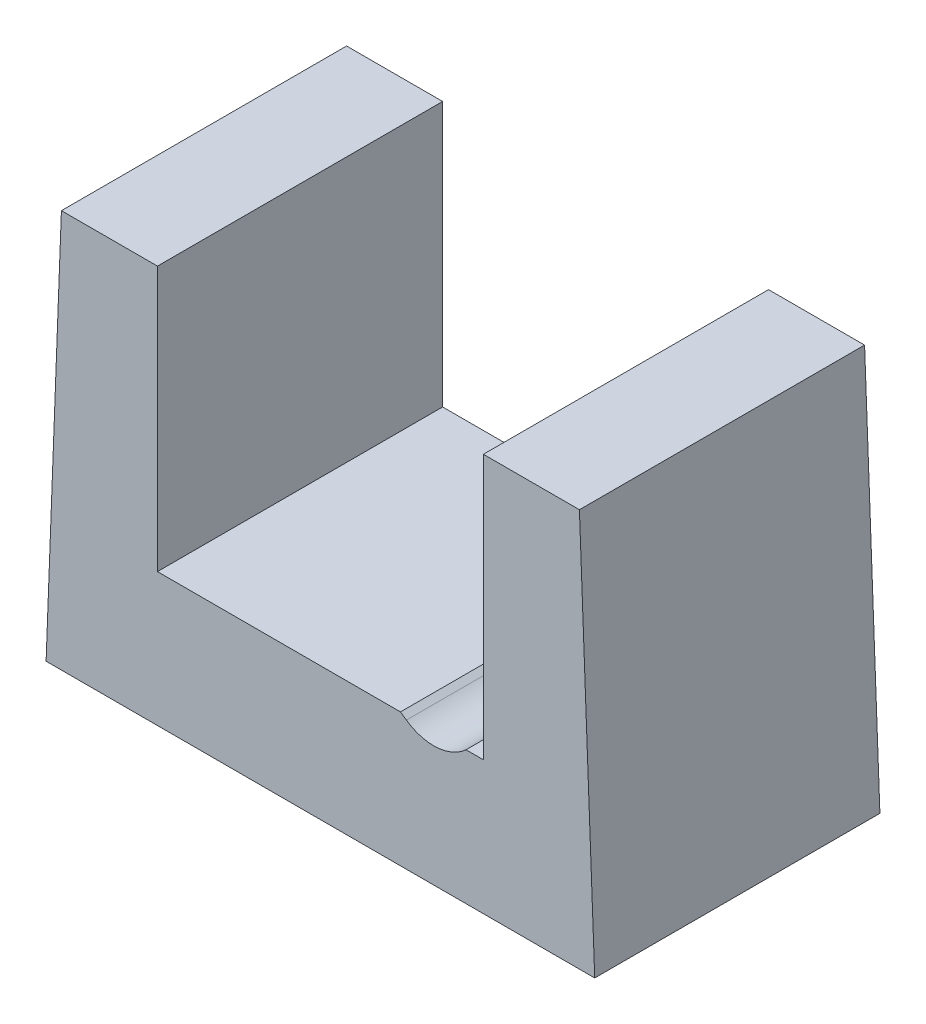
ISO-10303-21;
HEADER;
FILE_DESCRIPTION(('STEP AP214'),'2;1');
FILE_NAME('part.step','',(''),(''),'','','');
FILE_SCHEMA(('AUTOMOTIVE_DESIGN { 1 0 10303 214 1 1 1 1 }'));
ENDSEC;
DATA;
#1=APPLICATION_CONTEXT('core data for automotive mechanical design processes');
#2=APPLICATION_PROTOCOL_DEFINITION('international standard','automotive_design',2000,#1);
#3=PRODUCT_CONTEXT('',#1,'mechanical');
#4=PRODUCT('Part','Part','',(#3));
#5=PRODUCT_RELATED_PRODUCT_CATEGORY('part','',(#4));
#6=PRODUCT_DEFINITION_FORMATION('','',#4);
#7=PRODUCT_DEFINITION_CONTEXT('part definition',#1,'design');
#8=PRODUCT_DEFINITION('design','',#6,#7);
#9=PRODUCT_DEFINITION_SHAPE('','',#8);
#10=(LENGTH_UNIT() NAMED_UNIT(*) SI_UNIT(.MILLI.,.METRE.));
#11=(NAMED_UNIT(*) PLANE_ANGLE_UNIT() SI_UNIT($,.RADIAN.));
#12=(NAMED_UNIT(*) SI_UNIT($,.STERADIAN.) SOLID_ANGLE_UNIT());
#13=UNCERTAINTY_MEASURE_WITH_UNIT(LENGTH_MEASURE(1.E-05),#10,'distance_accuracy_value','');
#14=(GEOMETRIC_REPRESENTATION_CONTEXT(3) GLOBAL_UNCERTAINTY_ASSIGNED_CONTEXT((#13)) GLOBAL_UNIT_ASSIGNED_CONTEXT((#10,
#11,#12)) REPRESENTATION_CONTEXT('',''));
#15=CARTESIAN_POINT('',(0.,0.,0.));
#16=DIRECTION('',(0.,0.,1.));
#17=DIRECTION('',(1.,0.,0.));
#18=AXIS2_PLACEMENT_3D('',#15,#16,#17);
#19=CARTESIAN_POINT('',(0.,147.690874164974,21.));
#20=DIRECTION('',(0.,0.,1.));
#21=DIRECTION('',(1.,0.,0.));
#22=AXIS2_PLACEMENT_3D('',#19,#20,#21);
#23=PLANE('',#22);
#24=DIRECTION('',(0.,-1.,0.));
#25=VECTOR('',#24,1.);
#26=CARTESIAN_POINT('',(-12.,111.380372398628,21.));
#27=LINE('',#26,#25);
#28=CARTESIAN_POINT('',(-12.,120.174052381478,21.));
#29=VERTEX_POINT('',#28);
#30=CARTESIAN_POINT('',(-12.,100.690874164974,21.));
#31=VERTEX_POINT('',#30);
#32=EDGE_CURVE('E169',#29,#31,#27,.T.);
#33=ORIENTED_EDGE('',*,*,#32,.F.);
#34=DIRECTION('',(1.,0.,0.));
#35=VECTOR('',#34,1.);
#36=CARTESIAN_POINT('',(-19.0723488998107,120.174052381478,21.));
#37=LINE('',#36,#35);
#38=CARTESIAN_POINT('',(-19.0723488998107,120.174052381478,21.));
#39=VERTEX_POINT('',#38);
#40=EDGE_CURVE('E184',#39,#29,#37,.T.);
#41=ORIENTED_EDGE('',*,*,#40,.F.);
#42=DIRECTION('',(-0.038457914243594,-0.999260220779369,0.));
#43=VECTOR('',#42,1.);
#44=CARTESIAN_POINT('',(-20.2,90.8740523814777,21.));
#45=LINE('',#44,#43);
#46=CARTESIAN_POINT('',(-20.2,90.8740523814777,21.));
#47=VERTEX_POINT('',#46);
#48=EDGE_CURVE('E219',#39,#47,#45,.T.);
#49=ORIENTED_EDGE('',*,*,#48,.T.);
#50=DIRECTION('',(-1.,0.,0.));
#51=VECTOR('',#50,1.);
#52=CARTESIAN_POINT('',(-20.2,90.8740523814778,21.));
#53=LINE('',#52,#51);
#54=CARTESIAN_POINT('',(20.2,90.8740523814778,21.));
#55=VERTEX_POINT('',#54);
#56=EDGE_CURVE('E191',#55,#47,#53,.T.);
#57=ORIENTED_EDGE('',*,*,#56,.F.);
#58=DIRECTION('',(-0.038457914243594,0.999260220779369,0.));
#59=VECTOR('',#58,1.);
#60=CARTESIAN_POINT('',(20.2,90.8740523814777,21.));
#61=LINE('',#60,#59);
#62=CARTESIAN_POINT('',(19.0723488998107,120.174052381478,21.));
#63=VERTEX_POINT('',#62);
#64=EDGE_CURVE('E216',#55,#63,#61,.T.);
#65=ORIENTED_EDGE('',*,*,#64,.T.);
#66=CARTESIAN_POINT('',(12.,120.174052381478,21.));
#67=VERTEX_POINT('',#66);
#68=EDGE_CURVE('E187',#67,#63,#37,.T.);
#69=ORIENTED_EDGE('',*,*,#68,.F.);
#70=DIRECTION('',(0.,-1.,0.));
#71=VECTOR('',#70,1.);
#72=CARTESIAN_POINT('',(12.,0.,21.));
#73=LINE('',#72,#71);
#74=CARTESIAN_POINT('',(12.,100.690874164974,21.));
#75=VERTEX_POINT('',#74);
#76=EDGE_CURVE('E213',#67,#75,#73,.T.);
#77=ORIENTED_EDGE('',*,*,#76,.T.);
#78=DIRECTION('',(1.,0.,0.));
#79=VECTOR('',#78,1.);
#80=CARTESIAN_POINT('',(12.,100.690874164974,21.));
#81=LINE('',#80,#79);
#82=CARTESIAN_POINT('',(10.722091306153,100.690874164974,21.));
#83=VERTEX_POINT('',#82);
#84=EDGE_CURVE('E178',#83,#75,#81,.T.);
#85=ORIENTED_EDGE('',*,*,#84,.F.);
#86=CARTESIAN_POINT('',(8.33781982131321,103.253148445097,21.));
#87=DIRECTION('',(0.,0.,1.));
#88=DIRECTION('',(1.,0.,0.));
#89=AXIS2_PLACEMENT_3D('',#86,#87,#88);
#90=CIRCLE('',#89,3.5);
#91=CARTESIAN_POINT('',(6.33135958301197,100.385376258867,21.));
#92=VERTEX_POINT('',#91);
#93=EDGE_CURVE('E202',#92,#83,#90,.T.);
#94=ORIENTED_EDGE('',*,*,#93,.F.);
#95=DIRECTION('',(0.819363481780086,-0.573274353800354,0.));
#96=VECTOR('',#95,1.);
#97=CARTESIAN_POINT('',(-5.95909264368933,108.984491565872,21.));
#98=LINE('',#97,#96);
#99=CARTESIAN_POINT('',(5.89472077933055,100.690874164974,21.));
#100=VERTEX_POINT('',#99);
#101=EDGE_CURVE('E200',#100,#92,#98,.T.);
#102=ORIENTED_EDGE('',*,*,#101,.F.);
#103=DIRECTION('',(1.,0.,0.));
#104=VECTOR('',#103,1.);
#105=CARTESIAN_POINT('',(-12.,100.690874164974,21.));
#106=LINE('',#105,#104);
#107=EDGE_CURVE('E158',#31,#100,#106,.T.);
#108=ORIENTED_EDGE('',*,*,#107,.F.);
#109=EDGE_LOOP('',(#33,#41,#49,#57,#65,#69,#77,#85,#94,#102,#108));
#110=FACE_BOUND('',#109,.T.);
#111=ADVANCED_FACE('F69',(#110),#23,.T.);
#112=CARTESIAN_POINT('',(0.,147.690874164974,0.));
#113=DIRECTION('',(0.,0.,1.));
#114=DIRECTION('',(1.,0.,0.));
#115=AXIS2_PLACEMENT_3D('',#112,#113,#114);
#116=PLANE('',#115);
#117=DIRECTION('',(1.,0.,0.));
#118=VECTOR('',#117,1.);
#119=CARTESIAN_POINT('',(-19.0723488998107,120.174052381478,0.));
#120=LINE('',#119,#118);
#121=CARTESIAN_POINT('',(-19.0723488998107,120.174052381478,0.));
#122=VERTEX_POINT('',#121);
#123=CARTESIAN_POINT('',(-12.,120.174052381478,0.));
#124=VERTEX_POINT('',#123);
#125=EDGE_CURVE('E157',#122,#124,#120,.T.);
#126=ORIENTED_EDGE('',*,*,#125,.T.);
#127=DIRECTION('',(0.,1.,0.));
#128=VECTOR('',#127,1.);
#129=CARTESIAN_POINT('',(-12.,111.380372398628,0.));
#130=LINE('',#129,#128);
#131=CARTESIAN_POINT('',(-12.,100.690874164974,0.));
#132=VERTEX_POINT('',#131);
#133=EDGE_CURVE('E84',#132,#124,#130,.T.);
#134=ORIENTED_EDGE('',*,*,#133,.F.);
#135=DIRECTION('',(-1.,0.,0.));
#136=VECTOR('',#135,1.);
#137=CARTESIAN_POINT('',(-12.,100.690874164974,0.));
#138=LINE('',#137,#136);
#139=CARTESIAN_POINT('',(5.89472077933055,100.690874164974,0.));
#140=VERTEX_POINT('',#139);
#141=EDGE_CURVE('E154',#140,#132,#138,.T.);
#142=ORIENTED_EDGE('',*,*,#141,.F.);
#143=DIRECTION('',(-0.819363481780086,0.573274353800354,0.));
#144=VECTOR('',#143,1.);
#145=CARTESIAN_POINT('',(-5.95909264368933,108.984491565872,0.));
#146=LINE('',#145,#144);
#147=CARTESIAN_POINT('',(6.33135958301197,100.385376258867,0.));
#148=VERTEX_POINT('',#147);
#149=EDGE_CURVE('E159',#148,#140,#146,.T.);
#150=ORIENTED_EDGE('',*,*,#149,.F.);
#151=CARTESIAN_POINT('',(8.33781982131321,103.253148445097,0.));
#152=DIRECTION('',(0.,0.,1.));
#153=DIRECTION('',(1.,0.,0.));
#154=AXIS2_PLACEMENT_3D('',#151,#152,#153);
#155=CIRCLE('',#154,3.5);
#156=CARTESIAN_POINT('',(10.722091306153,100.690874164974,0.));
#157=VERTEX_POINT('',#156);
#158=EDGE_CURVE('E196',#157,#148,#155,.F.);
#159=ORIENTED_EDGE('',*,*,#158,.F.);
#160=DIRECTION('',(1.,0.,0.));
#161=VECTOR('',#160,1.);
#162=CARTESIAN_POINT('',(12.,100.690874164974,0.));
#163=LINE('',#162,#161);
#164=CARTESIAN_POINT('',(12.,100.690874164974,0.));
#165=VERTEX_POINT('',#164);
#166=EDGE_CURVE('E173',#157,#165,#163,.T.);
#167=ORIENTED_EDGE('',*,*,#166,.T.);
#168=DIRECTION('',(0.,1.,0.));
#169=VECTOR('',#168,1.);
#170=CARTESIAN_POINT('',(12.,0.,0.));
#171=LINE('',#170,#169);
#172=CARTESIAN_POINT('',(12.,120.174052381478,0.));
#173=VERTEX_POINT('',#172);
#174=EDGE_CURVE('E168',#165,#173,#171,.T.);
#175=ORIENTED_EDGE('',*,*,#174,.T.);
#176=CARTESIAN_POINT('',(19.0723488998107,120.174052381478,0.));
#177=VERTEX_POINT('',#176);
#178=EDGE_CURVE('E91',#173,#177,#120,.T.);
#179=ORIENTED_EDGE('',*,*,#178,.T.);
#180=DIRECTION('',(-0.038457914243594,0.999260220779369,0.));
#181=VECTOR('',#180,1.);
#182=CARTESIAN_POINT('',(20.2,90.8740523814777,0.));
#183=LINE('',#182,#181);
#184=CARTESIAN_POINT('',(20.2,90.8740523814778,0.));
#185=VERTEX_POINT('',#184);
#186=EDGE_CURVE('E215',#185,#177,#183,.T.);
#187=ORIENTED_EDGE('',*,*,#186,.F.);
#188=DIRECTION('',(-1.,0.,0.));
#189=VECTOR('',#188,1.);
#190=CARTESIAN_POINT('',(-20.2,90.8740523814778,0.));
#191=LINE('',#190,#189);
#192=CARTESIAN_POINT('',(-20.2,90.8740523814778,0.));
#193=VERTEX_POINT('',#192);
#194=EDGE_CURVE('E193',#185,#193,#191,.T.);
#195=ORIENTED_EDGE('',*,*,#194,.T.);
#196=DIRECTION('',(-0.038457914243594,-0.999260220779369,0.));
#197=VECTOR('',#196,1.);
#198=CARTESIAN_POINT('',(-20.2,90.8740523814777,0.));
#199=LINE('',#198,#197);
#200=EDGE_CURVE('E220',#122,#193,#199,.T.);
#201=ORIENTED_EDGE('',*,*,#200,.F.);
#202=EDGE_LOOP('',(#126,#134,#142,#150,#159,#167,#175,#179,#187,#195,#201));
#203=FACE_BOUND('',#202,.T.);
#204=ADVANCED_FACE('F152',(#203),#116,.F.);
#205=CARTESIAN_POINT('',(20.2,90.8740523814777,21.));
#206=DIRECTION('',(-0.999260220779368,-0.038457914243594,0.));
#207=DIRECTION('',(0.038457914243594,-0.999260220779369,0.));
#208=AXIS2_PLACEMENT_3D('',#205,#206,#207);
#209=PLANE('',#208);
#210=ORIENTED_EDGE('',*,*,#186,.T.);
#211=DIRECTION('',(0.,0.,1.));
#212=VECTOR('',#211,1.);
#213=CARTESIAN_POINT('',(19.0723488998107,120.174052381478,0.));
#214=LINE('',#213,#212);
#215=EDGE_CURVE('E188',#177,#63,#214,.T.);
#216=ORIENTED_EDGE('',*,*,#215,.T.);
#217=ORIENTED_EDGE('',*,*,#64,.F.);
#218=DIRECTION('',(0.,0.,-1.));
#219=VECTOR('',#218,1.);
#220=CARTESIAN_POINT('',(20.2,90.8740523814777,21.));
#221=LINE('',#220,#219);
#222=EDGE_CURVE('E77',#55,#185,#221,.T.);
#223=ORIENTED_EDGE('',*,*,#222,.T.);
#224=EDGE_LOOP('',(#210,#216,#217,#223));
#225=FACE_BOUND('',#224,.T.);
#226=ADVANCED_FACE('F71',(#225),#209,.F.);
#227=CARTESIAN_POINT('',(-20.2,90.8740523814777,21.));
#228=DIRECTION('',(0.999260220779368,-0.038457914243594,0.));
#229=DIRECTION('',(0.038457914243594,0.999260220779369,0.));
#230=AXIS2_PLACEMENT_3D('',#227,#228,#229);
#231=PLANE('',#230);
#232=ORIENTED_EDGE('',*,*,#48,.F.);
#233=DIRECTION('',(0.,0.,1.));
#234=VECTOR('',#233,1.);
#235=CARTESIAN_POINT('',(-19.0723488998107,120.174052381478,0.));
#236=LINE('',#235,#234);
#237=EDGE_CURVE('E183',#122,#39,#236,.T.);
#238=ORIENTED_EDGE('',*,*,#237,.F.);
#239=ORIENTED_EDGE('',*,*,#200,.T.);
#240=DIRECTION('',(0.,0.,-1.));
#241=VECTOR('',#240,1.);
#242=CARTESIAN_POINT('',(-20.2,90.8740523814777,21.));
#243=LINE('',#242,#241);
#244=EDGE_CURVE('E222',#47,#193,#243,.T.);
#245=ORIENTED_EDGE('',*,*,#244,.F.);
#246=EDGE_LOOP('',(#232,#238,#239,#245));
#247=FACE_BOUND('',#246,.T.);
#248=ADVANCED_FACE('F264',(#247),#231,.F.);
#249=CARTESIAN_POINT('',(12.,0.,-0.001000000000001));
#250=DIRECTION('',(-1.,0.,0.));
#251=DIRECTION('',(0.,0.,1.));
#252=AXIS2_PLACEMENT_3D('',#249,#250,#251);
#253=PLANE('',#252);
#254=DIRECTION('',(0.,0.,1.));
#255=VECTOR('',#254,1.);
#256=CARTESIAN_POINT('',(12.,120.174052381478,-0.001000000000001));
#257=LINE('',#256,#255);
#258=EDGE_CURVE('E12',#173,#67,#257,.T.);
#259=ORIENTED_EDGE('',*,*,#258,.F.);
#260=ORIENTED_EDGE('',*,*,#174,.F.);
#261=DIRECTION('',(0.,0.,1.));
#262=VECTOR('',#261,1.);
#263=CARTESIAN_POINT('',(12.,100.690874164974,0.));
#264=LINE('',#263,#262);
#265=EDGE_CURVE('E239',#165,#75,#264,.T.);
#266=ORIENTED_EDGE('',*,*,#265,.T.);
#267=ORIENTED_EDGE('',*,*,#76,.F.);
#268=EDGE_LOOP('',(#259,#260,#266,#267));
#269=FACE_BOUND('',#268,.T.);
#270=ADVANCED_FACE('F237',(#269),#253,.T.);
#271=CARTESIAN_POINT('',(-12.,100.690874164974,-0.001000000000001));
#272=DIRECTION('',(0.,-1.,0.));
#273=DIRECTION('',(0.,0.,-1.));
#274=AXIS2_PLACEMENT_3D('',#271,#272,#273);
#275=PLANE('',#274);
#276=ORIENTED_EDGE('',*,*,#141,.T.);
#277=DIRECTION('',(0.,0.,1.));
#278=VECTOR('',#277,1.);
#279=CARTESIAN_POINT('',(-12.,100.690874164974,0.));
#280=LINE('',#279,#278);
#281=EDGE_CURVE('E164',#132,#31,#280,.T.);
#282=ORIENTED_EDGE('',*,*,#281,.T.);
#283=ORIENTED_EDGE('',*,*,#107,.T.);
#284=DIRECTION('',(0.,0.,1.));
#285=VECTOR('',#284,1.);
#286=CARTESIAN_POINT('',(5.89472077933055,100.690874164974,0.));
#287=LINE('',#286,#285);
#288=EDGE_CURVE('E166',#140,#100,#287,.T.);
#289=ORIENTED_EDGE('',*,*,#288,.F.);
#290=EDGE_LOOP('',(#276,#282,#283,#289));
#291=FACE_BOUND('',#290,.T.);
#292=ADVANCED_FACE('F163',(#291),#275,.F.);
#293=CARTESIAN_POINT('',(-12.,111.380372398628,-0.001000000000001));
#294=DIRECTION('',(-1.,0.,0.));
#295=DIRECTION('',(0.,0.,1.));
#296=AXIS2_PLACEMENT_3D('',#293,#294,#295);
#297=PLANE('',#296);
#298=ORIENTED_EDGE('',*,*,#32,.T.);
#299=ORIENTED_EDGE('',*,*,#281,.F.);
#300=ORIENTED_EDGE('',*,*,#133,.T.);
#301=DIRECTION('',(0.,0.,1.));
#302=VECTOR('',#301,1.);
#303=CARTESIAN_POINT('',(-12.,120.174052381478,0.));
#304=LINE('',#303,#302);
#305=EDGE_CURVE('E245',#124,#29,#304,.T.);
#306=ORIENTED_EDGE('',*,*,#305,.T.);
#307=EDGE_LOOP('',(#298,#299,#300,#306));
#308=FACE_BOUND('',#307,.T.);
#309=ADVANCED_FACE('F171',(#308),#297,.F.);
#310=CARTESIAN_POINT('',(8.33781982131321,103.253148445097,-0.001000000000001));
#311=DIRECTION('',(0.,0.,1.));
#312=DIRECTION('',(1.,0.,0.));
#313=AXIS2_PLACEMENT_3D('',#310,#311,#312);
#314=CYLINDRICAL_SURFACE('',#313,3.5);
#315=ORIENTED_EDGE('',*,*,#93,.T.);
#316=DIRECTION('',(0.,0.,1.));
#317=VECTOR('',#316,1.);
#318=CARTESIAN_POINT('',(10.722091306153,100.690874164974,0.));
#319=LINE('',#318,#317);
#320=EDGE_CURVE('E175',#157,#83,#319,.T.);
#321=ORIENTED_EDGE('',*,*,#320,.F.);
#322=ORIENTED_EDGE('',*,*,#158,.T.);
#323=DIRECTION('',(0.,0.,1.));
#324=VECTOR('',#323,1.);
#325=CARTESIAN_POINT('',(6.33135958301197,100.385376258867,-0.001000000000001));
#326=LINE('',#325,#324);
#327=EDGE_CURVE('E205',#148,#92,#326,.T.);
#328=ORIENTED_EDGE('',*,*,#327,.T.);
#329=EDGE_LOOP('',(#315,#321,#322,#328));
#330=FACE_BOUND('',#329,.T.);
#331=ADVANCED_FACE('F254',(#330),#314,.F.);
#332=CARTESIAN_POINT('',(-5.95909264368933,108.984491565872,-0.001000000000001));
#333=DIRECTION('',(-0.573274353800354,-0.819363481780086,0.));
#334=DIRECTION('',(0.819363481780086,-0.573274353800354,0.));
#335=AXIS2_PLACEMENT_3D('',#332,#333,#334);
#336=PLANE('',#335);
#337=ORIENTED_EDGE('',*,*,#149,.T.);
#338=ORIENTED_EDGE('',*,*,#288,.T.);
#339=ORIENTED_EDGE('',*,*,#101,.T.);
#340=ORIENTED_EDGE('',*,*,#327,.F.);
#341=EDGE_LOOP('',(#337,#338,#339,#340));
#342=FACE_BOUND('',#341,.T.);
#343=ADVANCED_FACE('F257',(#342),#336,.F.);
#344=CARTESIAN_POINT('',(-20.2,90.8740523814778,0.));
#345=DIRECTION('',(0.,1.,0.));
#346=DIRECTION('',(0.,0.,1.));
#347=AXIS2_PLACEMENT_3D('',#344,#345,#346);
#348=PLANE('',#347);
#349=ORIENTED_EDGE('',*,*,#56,.T.);
#350=ORIENTED_EDGE('',*,*,#244,.T.);
#351=ORIENTED_EDGE('',*,*,#194,.F.);
#352=ORIENTED_EDGE('',*,*,#222,.F.);
#353=EDGE_LOOP('',(#349,#350,#351,#352));
#354=FACE_BOUND('',#353,.T.);
#355=ADVANCED_FACE('F266',(#354),#348,.F.);
#356=CARTESIAN_POINT('',(-19.0723488998107,120.174052381478,0.));
#357=DIRECTION('',(0.,-1.,0.));
#358=DIRECTION('',(0.,0.,-1.));
#359=AXIS2_PLACEMENT_3D('',#356,#357,#358);
#360=PLANE('',#359);
#361=ORIENTED_EDGE('',*,*,#258,.T.);
#362=ORIENTED_EDGE('',*,*,#68,.T.);
#363=ORIENTED_EDGE('',*,*,#215,.F.);
#364=ORIENTED_EDGE('',*,*,#178,.F.);
#365=EDGE_LOOP('',(#361,#362,#363,#364));
#366=FACE_BOUND('',#365,.T.);
#367=ADVANCED_FACE('F268',(#366),#360,.F.);
#368=ORIENTED_EDGE('',*,*,#40,.T.);
#369=ORIENTED_EDGE('',*,*,#305,.F.);
#370=ORIENTED_EDGE('',*,*,#125,.F.);
#371=ORIENTED_EDGE('',*,*,#237,.T.);
#372=EDGE_LOOP('',(#368,#369,#370,#371));
#373=FACE_BOUND('',#372,.T.);
#374=ADVANCED_FACE('F261',(#373),#360,.F.);
#375=CARTESIAN_POINT('',(12.,100.690874164974,0.));
#376=DIRECTION('',(0.,-1.,0.));
#377=DIRECTION('',(0.,0.,-1.));
#378=AXIS2_PLACEMENT_3D('',#375,#376,#377);
#379=PLANE('',#378);
#380=ORIENTED_EDGE('',*,*,#84,.T.);
#381=ORIENTED_EDGE('',*,*,#265,.F.);
#382=ORIENTED_EDGE('',*,*,#166,.F.);
#383=ORIENTED_EDGE('',*,*,#320,.T.);
#384=EDGE_LOOP('',(#380,#381,#382,#383));
#385=FACE_BOUND('',#384,.T.);
#386=ADVANCED_FACE('F242',(#385),#379,.F.);
#387=CLOSED_SHELL('',(#111,#204,#226,#248,#270,#292,#309,#331,#343,#355,#367,#374,#386));
#388=MANIFOLD_SOLID_BREP('B2',#387);
#389=ADVANCED_BREP_SHAPE_REPRESENTATION('',(#18,#388),#14);
#390=SHAPE_DEFINITION_REPRESENTATION(#9,#389);
ENDSEC;
END-ISO-10303-21;
